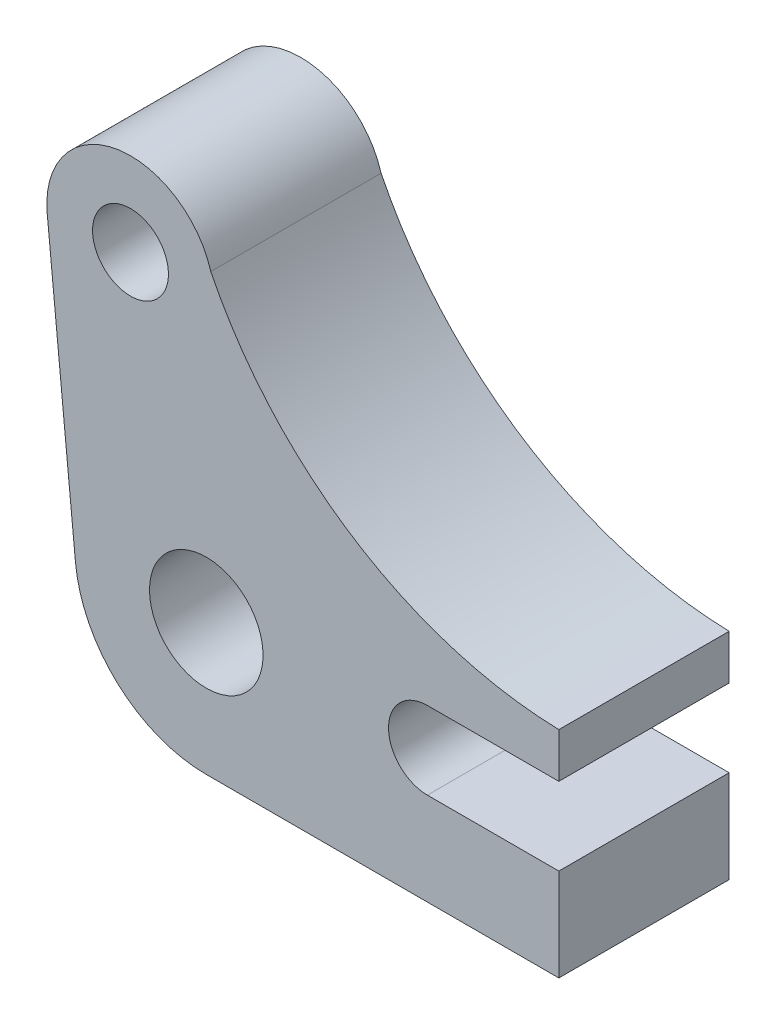
ISO-10303-21;
HEADER;
FILE_DESCRIPTION(('STEP AP214'),'2;1');
FILE_NAME('part.step','',(''),(''),'','','');
FILE_SCHEMA(('AUTOMOTIVE_DESIGN { 1 0 10303 214 1 1 1 1 }'));
ENDSEC;
DATA;
#1=APPLICATION_CONTEXT('core data for automotive mechanical design processes');
#2=APPLICATION_PROTOCOL_DEFINITION('international standard','automotive_design',2000,#1);
#3=PRODUCT_CONTEXT('',#1,'mechanical');
#4=PRODUCT('Part','Part','',(#3));
#5=PRODUCT_RELATED_PRODUCT_CATEGORY('part','',(#4));
#6=PRODUCT_DEFINITION_FORMATION('','',#4);
#7=PRODUCT_DEFINITION_CONTEXT('part definition',#1,'design');
#8=PRODUCT_DEFINITION('design','',#6,#7);
#9=PRODUCT_DEFINITION_SHAPE('','',#8);
#10=(LENGTH_UNIT() NAMED_UNIT(*) SI_UNIT(.MILLI.,.METRE.));
#11=(NAMED_UNIT(*) PLANE_ANGLE_UNIT() SI_UNIT($,.RADIAN.));
#12=(NAMED_UNIT(*) SI_UNIT($,.STERADIAN.) SOLID_ANGLE_UNIT());
#13=UNCERTAINTY_MEASURE_WITH_UNIT(LENGTH_MEASURE(1.E-05),#10,'distance_accuracy_value','');
#14=(GEOMETRIC_REPRESENTATION_CONTEXT(3) GLOBAL_UNCERTAINTY_ASSIGNED_CONTEXT((#13)) GLOBAL_UNIT_ASSIGNED_CONTEXT((#10,
#11,#12)) REPRESENTATION_CONTEXT('',''));
#15=CARTESIAN_POINT('',(0.,0.,0.));
#16=DIRECTION('',(0.,0.,1.));
#17=DIRECTION('',(1.,0.,0.));
#18=AXIS2_PLACEMENT_3D('',#15,#16,#17);
#19=CARTESIAN_POINT('',(-60.0180476161702,-52.9564208831454,28.5));
#20=DIRECTION('',(0.,0.,1.));
#21=DIRECTION('',(1.,0.,0.));
#22=AXIS2_PLACEMENT_3D('',#19,#20,#21);
#23=PLANE('',#22);
#24=CARTESIAN_POINT('',(-72.700180587229,-5.62605533095061,28.5));
#25=DIRECTION('',(0.,0.,1.));
#26=DIRECTION('',(1.,0.,0.));
#27=AXIS2_PLACEMENT_3D('',#24,#25,#26);
#28=CIRCLE('',#27,6.34999999998991);
#29=CARTESIAN_POINT('',(-79.0501805872189,-5.62605533095061,28.5));
#30=VERTEX_POINT('',#29);
#31=EDGE_CURVE('E164',#30,#30,#28,.T.);
#32=ORIENTED_EDGE('',*,*,#31,.F.);
#33=EDGE_LOOP('',(#32));
#34=FACE_BOUND('',#33,.T.);
#35=CARTESIAN_POINT('',(-60.0180476161702,-52.9564208831454,28.5));
#36=DIRECTION('',(0.,0.,1.));
#37=DIRECTION('',(1.,0.,0.));
#38=AXIS2_PLACEMENT_3D('',#35,#36,#37);
#39=CIRCLE('',#38,22.);
#40=CARTESIAN_POINT('',(-81.9129183847161,-55.1045908086106,28.5));
#41=VERTEX_POINT('',#40);
#42=CARTESIAN_POINT('',(-60.0180476161702,-74.9564208831454,28.5));
#43=VERTEX_POINT('',#42);
#44=EDGE_CURVE('E188',#41,#43,#39,.T.);
#45=ORIENTED_EDGE('',*,*,#44,.T.);
#46=DIRECTION('',(1.,0.,0.));
#47=VECTOR('',#46,1.);
#48=CARTESIAN_POINT('',(-1.01804761617024,-74.9564208831454,28.5));
#49=LINE('',#48,#47);
#50=CARTESIAN_POINT('',(-1.01804761617024,-74.9564208831454,28.5));
#51=VERTEX_POINT('',#50);
#52=EDGE_CURVE('E112',#43,#51,#49,.T.);
#53=ORIENTED_EDGE('',*,*,#52,.T.);
#54=DIRECTION('',(0.,1.,0.));
#55=VECTOR('',#54,1.);
#56=CARTESIAN_POINT('',(-1.01804761617024,-59.4564208831454,28.5));
#57=LINE('',#56,#55);
#58=CARTESIAN_POINT('',(-1.01804761617024,-59.4564208831454,28.5));
#59=VERTEX_POINT('',#58);
#60=EDGE_CURVE('E217',#51,#59,#57,.T.);
#61=ORIENTED_EDGE('',*,*,#60,.T.);
#62=DIRECTION('',(-1.,0.,0.));
#63=VECTOR('',#62,1.);
#64=CARTESIAN_POINT('',(-23.0180476161702,-59.4564208831454,28.5));
#65=LINE('',#64,#63);
#66=CARTESIAN_POINT('',(-23.0180476161702,-59.4564208831454,28.5));
#67=VERTEX_POINT('',#66);
#68=EDGE_CURVE('E237',#59,#67,#65,.T.);
#69=ORIENTED_EDGE('',*,*,#68,.T.);
#70=CARTESIAN_POINT('',(-23.0180476161702,-52.9564208831454,28.5));
#71=DIRECTION('',(0.,0.,-1.));
#72=DIRECTION('',(-1.,0.,0.));
#73=AXIS2_PLACEMENT_3D('',#70,#71,#72);
#74=CIRCLE('',#73,6.5);
#75=CARTESIAN_POINT('',(-23.0180476161702,-46.4564208831454,28.5));
#76=VERTEX_POINT('',#75);
#77=EDGE_CURVE('E233',#67,#76,#74,.T.);
#78=ORIENTED_EDGE('',*,*,#77,.T.);
#79=DIRECTION('',(1.,0.,0.));
#80=VECTOR('',#79,1.);
#81=CARTESIAN_POINT('',(-1.01804761617024,-46.4564208831454,28.5));
#82=LINE('',#81,#80);
#83=CARTESIAN_POINT('',(-1.01804761617024,-46.4564208831454,28.5));
#84=VERTEX_POINT('',#83);
#85=EDGE_CURVE('E236',#76,#84,#82,.T.);
#86=ORIENTED_EDGE('',*,*,#85,.T.);
#87=DIRECTION('',(0.,1.,0.));
#88=VECTOR('',#87,1.);
#89=CARTESIAN_POINT('',(-1.01804761617024,-46.4564208831454,28.5));
#90=LINE('',#89,#88);
#91=CARTESIAN_POINT('',(-1.01804761617022,-38.9564208831454,28.5));
#92=VERTEX_POINT('',#91);
#93=EDGE_CURVE('E137',#84,#92,#90,.T.);
#94=ORIENTED_EDGE('',*,*,#93,.T.);
#95=CARTESIAN_POINT('',(0.786907620125597,28.0192622906377,28.5));
#96=DIRECTION('',(0.,0.,-1.));
#97=DIRECTION('',(-1.,0.,0.));
#98=AXIS2_PLACEMENT_3D('',#95,#96,#97);
#99=CIRCLE('',#98,67.);
#100=CARTESIAN_POINT('',(-59.2631461078246,-1.69590298351636,28.5));
#101=VERTEX_POINT('',#100);
#102=EDGE_CURVE('E131',#92,#101,#99,.T.);
#103=ORIENTED_EDGE('',*,*,#102,.T.);
#104=CARTESIAN_POINT('',(-72.7001808261938,-5.62605539498104,28.5));
#105=DIRECTION('',(0.,0.,1.));
#106=DIRECTION('',(1.,0.,0.));
#107=AXIS2_PLACEMENT_3D('',#104,#105,#106);
#108=CIRCLE('',#107,14.);
#109=CARTESIAN_POINT('',(-86.6332804061776,-6.99307262027707,28.5));
#110=VERTEX_POINT('',#109);
#111=EDGE_CURVE('E135',#101,#110,#108,.T.);
#112=ORIENTED_EDGE('',*,*,#111,.T.);
#113=DIRECTION('',(0.0976440875211458,-0.995221398570269,0.));
#114=VECTOR('',#113,1.);
#115=CARTESIAN_POINT('',(-86.6332804061776,-6.99307262027707,28.5));
#116=LINE('',#115,#114);
#117=EDGE_CURVE('E63',#110,#41,#116,.T.);
#118=ORIENTED_EDGE('',*,*,#117,.T.);
#119=EDGE_LOOP('',(#45,#53,#61,#69,#78,#86,#94,#103,#112,#118));
#120=FACE_BOUND('',#119,.T.);
#121=CARTESIAN_POINT('',(-60.0180476161702,-52.9564208831454,28.5));
#122=DIRECTION('',(0.,0.,1.));
#123=DIRECTION('',(1.,0.,0.));
#124=AXIS2_PLACEMENT_3D('',#121,#122,#123);
#125=CIRCLE('',#124,9.5);
#126=CARTESIAN_POINT('',(-69.5180476161702,-52.9564208831454,28.5));
#127=VERTEX_POINT('',#126);
#128=EDGE_CURVE('E255',#127,#127,#125,.T.);
#129=ORIENTED_EDGE('',*,*,#128,.F.);
#130=EDGE_LOOP('',(#129));
#131=FACE_BOUND('',#130,.T.);
#132=ADVANCED_FACE('F45',(#34,#120,#131),#23,.T.);
#133=CARTESIAN_POINT('',(-60.0180476161702,-52.9564208831454,0.));
#134=DIRECTION('',(0.,0.,1.));
#135=DIRECTION('',(1.,0.,0.));
#136=AXIS2_PLACEMENT_3D('',#133,#134,#135);
#137=PLANE('',#136);
#138=CARTESIAN_POINT('',(-60.0180476161702,-52.9564208831454,0.));
#139=DIRECTION('',(0.,0.,1.));
#140=DIRECTION('',(1.,0.,0.));
#141=AXIS2_PLACEMENT_3D('',#138,#139,#140);
#142=CIRCLE('',#141,22.);
#143=CARTESIAN_POINT('',(-81.9129183847161,-55.1045908086106,0.));
#144=VERTEX_POINT('',#143);
#145=CARTESIAN_POINT('',(-60.0180476161702,-74.9564208831454,0.));
#146=VERTEX_POINT('',#145);
#147=EDGE_CURVE('E159',#144,#146,#142,.T.);
#148=ORIENTED_EDGE('',*,*,#147,.F.);
#149=DIRECTION('',(0.0976440875211458,-0.995221398570269,0.));
#150=VECTOR('',#149,1.);
#151=CARTESIAN_POINT('',(-86.6332804061776,-6.99307262027707,0.));
#152=LINE('',#151,#150);
#153=CARTESIAN_POINT('',(-86.6332804061776,-6.99307262027707,0.));
#154=VERTEX_POINT('',#153);
#155=EDGE_CURVE('E104',#154,#144,#152,.T.);
#156=ORIENTED_EDGE('',*,*,#155,.F.);
#157=CARTESIAN_POINT('',(-72.7001808261938,-5.62605539498104,0.));
#158=DIRECTION('',(0.,0.,1.));
#159=DIRECTION('',(1.,0.,0.));
#160=AXIS2_PLACEMENT_3D('',#157,#158,#159);
#161=CIRCLE('',#160,14.);
#162=CARTESIAN_POINT('',(-59.2631461078246,-1.69590298351636,0.));
#163=VERTEX_POINT('',#162);
#164=EDGE_CURVE('E98',#163,#154,#161,.T.);
#165=ORIENTED_EDGE('',*,*,#164,.F.);
#166=CARTESIAN_POINT('',(0.786907620125597,28.0192622906377,0.));
#167=DIRECTION('',(0.,0.,-1.));
#168=DIRECTION('',(-1.,0.,0.));
#169=AXIS2_PLACEMENT_3D('',#166,#167,#168);
#170=CIRCLE('',#169,67.);
#171=CARTESIAN_POINT('',(-1.01804761617022,-38.9564208831454,0.));
#172=VERTEX_POINT('',#171);
#173=EDGE_CURVE('E146',#172,#163,#170,.T.);
#174=ORIENTED_EDGE('',*,*,#173,.F.);
#175=DIRECTION('',(0.,1.,0.));
#176=VECTOR('',#175,1.);
#177=CARTESIAN_POINT('',(-1.01804761617024,-46.4564208831454,0.));
#178=LINE('',#177,#176);
#179=CARTESIAN_POINT('',(-1.01804761617024,-46.4564208831454,0.));
#180=VERTEX_POINT('',#179);
#181=EDGE_CURVE('E179',#180,#172,#178,.T.);
#182=ORIENTED_EDGE('',*,*,#181,.F.);
#183=DIRECTION('',(1.,0.,0.));
#184=VECTOR('',#183,1.);
#185=CARTESIAN_POINT('',(-1.01804761617024,-46.4564208831454,0.));
#186=LINE('',#185,#184);
#187=CARTESIAN_POINT('',(-23.0180476161702,-46.4564208831454,0.));
#188=VERTEX_POINT('',#187);
#189=EDGE_CURVE('E176',#188,#180,#186,.T.);
#190=ORIENTED_EDGE('',*,*,#189,.F.);
#191=CARTESIAN_POINT('',(-23.0180476161702,-52.9564208831454,0.));
#192=DIRECTION('',(0.,0.,-1.));
#193=DIRECTION('',(-1.,0.,0.));
#194=AXIS2_PLACEMENT_3D('',#191,#192,#193);
#195=CIRCLE('',#194,6.5);
#196=CARTESIAN_POINT('',(-23.0180476161702,-59.4564208831454,0.));
#197=VERTEX_POINT('',#196);
#198=EDGE_CURVE('E173',#197,#188,#195,.T.);
#199=ORIENTED_EDGE('',*,*,#198,.F.);
#200=DIRECTION('',(-1.,0.,0.));
#201=VECTOR('',#200,1.);
#202=CARTESIAN_POINT('',(-23.0180476161702,-59.4564208831454,0.));
#203=LINE('',#202,#201);
#204=CARTESIAN_POINT('',(-1.01804761617024,-59.4564208831454,0.));
#205=VERTEX_POINT('',#204);
#206=EDGE_CURVE('E170',#205,#197,#203,.T.);
#207=ORIENTED_EDGE('',*,*,#206,.F.);
#208=DIRECTION('',(0.,1.,0.));
#209=VECTOR('',#208,1.);
#210=CARTESIAN_POINT('',(-1.01804761617024,-59.4564208831454,0.));
#211=LINE('',#210,#209);
#212=CARTESIAN_POINT('',(-1.01804761617024,-74.9564208831454,0.));
#213=VERTEX_POINT('',#212);
#214=EDGE_CURVE('E167',#213,#205,#211,.T.);
#215=ORIENTED_EDGE('',*,*,#214,.F.);
#216=DIRECTION('',(1.,0.,0.));
#217=VECTOR('',#216,1.);
#218=CARTESIAN_POINT('',(-1.01804761617024,-74.9564208831454,0.));
#219=LINE('',#218,#217);
#220=EDGE_CURVE('E163',#146,#213,#219,.T.);
#221=ORIENTED_EDGE('',*,*,#220,.F.);
#222=EDGE_LOOP('',(#148,#156,#165,#174,#182,#190,#199,#207,#215,#221));
#223=FACE_BOUND('',#222,.T.);
#224=CARTESIAN_POINT('',(-72.700180587229,-5.62605533095061,0.));
#225=DIRECTION('',(0.,0.,1.));
#226=DIRECTION('',(1.,0.,0.));
#227=AXIS2_PLACEMENT_3D('',#224,#225,#226);
#228=CIRCLE('',#227,6.34999999998991);
#229=CARTESIAN_POINT('',(-79.0501805872189,-5.62605533095061,0.));
#230=VERTEX_POINT('',#229);
#231=EDGE_CURVE('E251',#230,#230,#228,.T.);
#232=ORIENTED_EDGE('',*,*,#231,.T.);
#233=EDGE_LOOP('',(#232));
#234=FACE_BOUND('',#233,.T.);
#235=CARTESIAN_POINT('',(-60.0180476161702,-52.9564208831454,0.));
#236=DIRECTION('',(0.,0.,1.));
#237=DIRECTION('',(1.,0.,0.));
#238=AXIS2_PLACEMENT_3D('',#235,#236,#237);
#239=CIRCLE('',#238,9.5);
#240=CARTESIAN_POINT('',(-69.5180476161702,-52.9564208831454,0.));
#241=VERTEX_POINT('',#240);
#242=EDGE_CURVE('E259',#241,#241,#239,.T.);
#243=ORIENTED_EDGE('',*,*,#242,.T.);
#244=EDGE_LOOP('',(#243));
#245=FACE_BOUND('',#244,.T.);
#246=ADVANCED_FACE('F221',(#223,#234,#245),#137,.F.);
#247=CARTESIAN_POINT('',(-60.0180476161702,-52.9564208831454,28.5));
#248=DIRECTION('',(0.,0.,-1.));
#249=DIRECTION('',(-1.,0.,0.));
#250=AXIS2_PLACEMENT_3D('',#247,#248,#249);
#251=CYLINDRICAL_SURFACE('',#250,22.);
#252=ORIENTED_EDGE('',*,*,#147,.T.);
#253=DIRECTION('',(0.,0.,-1.));
#254=VECTOR('',#253,1.);
#255=CARTESIAN_POINT('',(-60.0180476161702,-74.9564208831454,28.5));
#256=LINE('',#255,#254);
#257=EDGE_CURVE('E11',#43,#146,#256,.T.);
#258=ORIENTED_EDGE('',*,*,#257,.F.);
#259=ORIENTED_EDGE('',*,*,#44,.F.);
#260=DIRECTION('',(0.,0.,-1.));
#261=VECTOR('',#260,1.);
#262=CARTESIAN_POINT('',(-81.9129183847161,-55.1045908086106,28.5));
#263=LINE('',#262,#261);
#264=EDGE_CURVE('E155',#41,#144,#263,.T.);
#265=ORIENTED_EDGE('',*,*,#264,.T.);
#266=EDGE_LOOP('',(#252,#258,#259,#265));
#267=FACE_BOUND('',#266,.T.);
#268=ADVANCED_FACE('F47',(#267),#251,.T.);
#269=CARTESIAN_POINT('',(-1.01804761617024,-74.9564208831454,28.5));
#270=DIRECTION('',(0.,1.,0.));
#271=DIRECTION('',(-1.,0.,0.));
#272=AXIS2_PLACEMENT_3D('',#269,#270,#271);
#273=PLANE('',#272);
#274=ORIENTED_EDGE('',*,*,#220,.T.);
#275=DIRECTION('',(0.,0.,-1.));
#276=VECTOR('',#275,1.);
#277=CARTESIAN_POINT('',(-1.01804761617024,-74.9564208831454,28.5));
#278=LINE('',#277,#276);
#279=EDGE_CURVE('E55',#51,#213,#278,.T.);
#280=ORIENTED_EDGE('',*,*,#279,.F.);
#281=ORIENTED_EDGE('',*,*,#52,.F.);
#282=ORIENTED_EDGE('',*,*,#257,.T.);
#283=EDGE_LOOP('',(#274,#280,#281,#282));
#284=FACE_BOUND('',#283,.T.);
#285=ADVANCED_FACE('F301',(#284),#273,.F.);
#286=CARTESIAN_POINT('',(-1.01804761617024,-59.4564208831454,28.5));
#287=DIRECTION('',(-1.,0.,0.));
#288=DIRECTION('',(0.,0.,1.));
#289=AXIS2_PLACEMENT_3D('',#286,#287,#288);
#290=PLANE('',#289);
#291=ORIENTED_EDGE('',*,*,#214,.T.);
#292=DIRECTION('',(0.,0.,-1.));
#293=VECTOR('',#292,1.);
#294=CARTESIAN_POINT('',(-1.01804761617024,-59.4564208831454,28.5));
#295=LINE('',#294,#293);
#296=EDGE_CURVE('E207',#59,#205,#295,.T.);
#297=ORIENTED_EDGE('',*,*,#296,.F.);
#298=ORIENTED_EDGE('',*,*,#60,.F.);
#299=ORIENTED_EDGE('',*,*,#279,.T.);
#300=EDGE_LOOP('',(#291,#297,#298,#299));
#301=FACE_BOUND('',#300,.T.);
#302=ADVANCED_FACE('F215',(#301),#290,.F.);
#303=CARTESIAN_POINT('',(-23.0180476161702,-59.4564208831454,28.5));
#304=DIRECTION('',(0.,-1.,0.));
#305=DIRECTION('',(1.,0.,0.));
#306=AXIS2_PLACEMENT_3D('',#303,#304,#305);
#307=PLANE('',#306);
#308=ORIENTED_EDGE('',*,*,#206,.T.);
#309=DIRECTION('',(0.,0.,-1.));
#310=VECTOR('',#309,1.);
#311=CARTESIAN_POINT('',(-23.0180476161702,-59.4564208831454,28.5));
#312=LINE('',#311,#310);
#313=EDGE_CURVE('E203',#67,#197,#312,.T.);
#314=ORIENTED_EDGE('',*,*,#313,.F.);
#315=ORIENTED_EDGE('',*,*,#68,.F.);
#316=ORIENTED_EDGE('',*,*,#296,.T.);
#317=EDGE_LOOP('',(#308,#314,#315,#316));
#318=FACE_BOUND('',#317,.T.);
#319=ADVANCED_FACE('F227',(#318),#307,.F.);
#320=CARTESIAN_POINT('',(-23.0180476161702,-52.9564208831454,28.5));
#321=DIRECTION('',(0.,0.,-1.));
#322=DIRECTION('',(-1.,0.,0.));
#323=AXIS2_PLACEMENT_3D('',#320,#321,#322);
#324=CYLINDRICAL_SURFACE('',#323,6.5);
#325=ORIENTED_EDGE('',*,*,#198,.T.);
#326=DIRECTION('',(0.,0.,-1.));
#327=VECTOR('',#326,1.);
#328=CARTESIAN_POINT('',(-23.0180476161702,-46.4564208831454,28.5));
#329=LINE('',#328,#327);
#330=EDGE_CURVE('E199',#76,#188,#329,.T.);
#331=ORIENTED_EDGE('',*,*,#330,.F.);
#332=ORIENTED_EDGE('',*,*,#77,.F.);
#333=ORIENTED_EDGE('',*,*,#313,.T.);
#334=EDGE_LOOP('',(#325,#331,#332,#333));
#335=FACE_BOUND('',#334,.T.);
#336=ADVANCED_FACE('F231',(#335),#324,.F.);
#337=CARTESIAN_POINT('',(-1.01804761617024,-46.4564208831454,28.5));
#338=DIRECTION('',(0.,1.,0.));
#339=DIRECTION('',(-1.,0.,0.));
#340=AXIS2_PLACEMENT_3D('',#337,#338,#339);
#341=PLANE('',#340);
#342=ORIENTED_EDGE('',*,*,#189,.T.);
#343=DIRECTION('',(0.,0.,-1.));
#344=VECTOR('',#343,1.);
#345=CARTESIAN_POINT('',(-1.01804761617024,-46.4564208831454,28.5));
#346=LINE('',#345,#344);
#347=EDGE_CURVE('E195',#84,#180,#346,.T.);
#348=ORIENTED_EDGE('',*,*,#347,.F.);
#349=ORIENTED_EDGE('',*,*,#85,.F.);
#350=ORIENTED_EDGE('',*,*,#330,.T.);
#351=EDGE_LOOP('',(#342,#348,#349,#350));
#352=FACE_BOUND('',#351,.T.);
#353=ADVANCED_FACE('F291',(#352),#341,.F.);
#354=CARTESIAN_POINT('',(-1.01804761617024,-46.4564208831454,28.5));
#355=DIRECTION('',(-1.,0.,0.));
#356=DIRECTION('',(0.,0.,1.));
#357=AXIS2_PLACEMENT_3D('',#354,#355,#356);
#358=PLANE('',#357);
#359=ORIENTED_EDGE('',*,*,#181,.T.);
#360=DIRECTION('',(0.,0.,-1.));
#361=VECTOR('',#360,1.);
#362=CARTESIAN_POINT('',(-1.01804761617022,-38.9564208831454,28.5));
#363=LINE('',#362,#361);
#364=EDGE_CURVE('E148',#92,#172,#363,.T.);
#365=ORIENTED_EDGE('',*,*,#364,.F.);
#366=ORIENTED_EDGE('',*,*,#93,.F.);
#367=ORIENTED_EDGE('',*,*,#347,.T.);
#368=EDGE_LOOP('',(#359,#365,#366,#367));
#369=FACE_BOUND('',#368,.T.);
#370=ADVANCED_FACE('F288',(#369),#358,.F.);
#371=CARTESIAN_POINT('',(0.786907620125597,28.0192622906377,28.5));
#372=DIRECTION('',(0.,0.,-1.));
#373=DIRECTION('',(-1.,0.,0.));
#374=AXIS2_PLACEMENT_3D('',#371,#372,#373);
#375=CYLINDRICAL_SURFACE('',#374,67.);
#376=ORIENTED_EDGE('',*,*,#173,.T.);
#377=DIRECTION('',(0.,0.,-1.));
#378=VECTOR('',#377,1.);
#379=CARTESIAN_POINT('',(-59.2631461078246,-1.69590298351636,28.5));
#380=LINE('',#379,#378);
#381=EDGE_CURVE('E143',#101,#163,#380,.T.);
#382=ORIENTED_EDGE('',*,*,#381,.F.);
#383=ORIENTED_EDGE('',*,*,#102,.F.);
#384=ORIENTED_EDGE('',*,*,#364,.T.);
#385=EDGE_LOOP('',(#376,#382,#383,#384));
#386=FACE_BOUND('',#385,.T.);
#387=ADVANCED_FACE('F144',(#386),#375,.F.);
#388=CARTESIAN_POINT('',(-72.7001808261938,-5.62605539498104,28.5));
#389=DIRECTION('',(0.,0.,-1.));
#390=DIRECTION('',(-1.,0.,0.));
#391=AXIS2_PLACEMENT_3D('',#388,#389,#390);
#392=CYLINDRICAL_SURFACE('',#391,14.);
#393=ORIENTED_EDGE('',*,*,#164,.T.);
#394=DIRECTION('',(0.,0.,-1.));
#395=VECTOR('',#394,1.);
#396=CARTESIAN_POINT('',(-86.6332804061776,-6.99307262027707,28.5));
#397=LINE('',#396,#395);
#398=EDGE_CURVE('E149',#110,#154,#397,.T.);
#399=ORIENTED_EDGE('',*,*,#398,.F.);
#400=ORIENTED_EDGE('',*,*,#111,.F.);
#401=ORIENTED_EDGE('',*,*,#381,.T.);
#402=EDGE_LOOP('',(#393,#399,#400,#401));
#403=FACE_BOUND('',#402,.T.);
#404=ADVANCED_FACE('F151',(#403),#392,.T.);
#405=CARTESIAN_POINT('',(-86.6332804061776,-6.99307262027707,28.5));
#406=DIRECTION('',(0.995221398570269,0.0976440875211458,0.));
#407=DIRECTION('',(-0.0976440875211458,0.995221398570269,0.));
#408=AXIS2_PLACEMENT_3D('',#405,#406,#407);
#409=PLANE('',#408);
#410=ORIENTED_EDGE('',*,*,#155,.T.);
#411=ORIENTED_EDGE('',*,*,#264,.F.);
#412=ORIENTED_EDGE('',*,*,#117,.F.);
#413=ORIENTED_EDGE('',*,*,#398,.T.);
#414=EDGE_LOOP('',(#410,#411,#412,#413));
#415=FACE_BOUND('',#414,.T.);
#416=ADVANCED_FACE('F281',(#415),#409,.F.);
#417=CARTESIAN_POINT('',(-72.700180587229,-5.62605533095061,28.5));
#418=DIRECTION('',(0.,0.,-1.));
#419=DIRECTION('',(-1.,0.,0.));
#420=AXIS2_PLACEMENT_3D('',#417,#418,#419);
#421=CYLINDRICAL_SURFACE('',#420,6.34999999998991);
#422=CARTESIAN_POINT('',(-79.0501805872189,-5.62605533095061,28.5));
#423=CARTESIAN_POINT('',(-79.0501805872189,-5.62605533095061,28.203125));
#424=CARTESIAN_POINT('',(-79.0501805872189,-5.62605533095061,27.90625));
#425=CARTESIAN_POINT('',(-79.0501805872189,-5.62605533095061,27.3125));
#426=CARTESIAN_POINT('',(-79.0501805872189,-5.62605533095061,27.015625));
#427=CARTESIAN_POINT('',(-79.0501805872189,-5.62605533095061,26.421875));
#428=CARTESIAN_POINT('',(-79.0501805872189,-5.62605533095061,26.125));
#429=CARTESIAN_POINT('',(-79.0501805872189,-5.62605533095061,25.53125));
#430=CARTESIAN_POINT('',(-79.0501805872189,-5.62605533095061,25.234375));
#431=CARTESIAN_POINT('',(-79.0501805872189,-5.62605533095061,24.640625));
#432=CARTESIAN_POINT('',(-79.0501805872189,-5.62605533095061,24.34375));
#433=CARTESIAN_POINT('',(-79.0501805872189,-5.62605533095061,23.75));
#434=CARTESIAN_POINT('',(-79.0501805872189,-5.62605533095061,23.453125));
#435=CARTESIAN_POINT('',(-79.0501805872189,-5.62605533095061,22.859375));
#436=CARTESIAN_POINT('',(-79.0501805872189,-5.62605533095061,22.5625));
#437=CARTESIAN_POINT('',(-79.0501805872189,-5.62605533095061,21.96875));
#438=CARTESIAN_POINT('',(-79.0501805872189,-5.62605533095061,21.671875));
#439=CARTESIAN_POINT('',(-79.0501805872189,-5.62605533095061,21.078125));
#440=CARTESIAN_POINT('',(-79.0501805872189,-5.62605533095061,20.78125));
#441=CARTESIAN_POINT('',(-79.0501805872189,-5.62605533095061,20.1875));
#442=CARTESIAN_POINT('',(-79.0501805872189,-5.62605533095061,19.890625));
#443=CARTESIAN_POINT('',(-79.0501805872189,-5.62605533095061,19.296875));
#444=CARTESIAN_POINT('',(-79.0501805872189,-5.62605533095061,19.));
#445=CARTESIAN_POINT('',(-79.0501805872189,-5.62605533095061,18.40625));
#446=CARTESIAN_POINT('',(-79.0501805872189,-5.62605533095061,18.109375));
#447=CARTESIAN_POINT('',(-79.0501805872189,-5.62605533095061,17.515625));
#448=CARTESIAN_POINT('',(-79.0501805872189,-5.62605533095061,17.21875));
#449=CARTESIAN_POINT('',(-79.0501805872189,-5.62605533095061,16.625));
#450=CARTESIAN_POINT('',(-79.0501805872189,-5.62605533095061,16.328125));
#451=CARTESIAN_POINT('',(-79.0501805872189,-5.62605533095061,15.734375));
#452=CARTESIAN_POINT('',(-79.0501805872189,-5.62605533095061,15.4375));
#453=CARTESIAN_POINT('',(-79.0501805872189,-5.62605533095061,14.84375));
#454=CARTESIAN_POINT('',(-79.0501805872189,-5.62605533095061,14.546875));
#455=CARTESIAN_POINT('',(-79.0501805872189,-5.62605533095061,13.953125));
#456=CARTESIAN_POINT('',(-79.0501805872189,-5.62605533095061,13.65625));
#457=CARTESIAN_POINT('',(-79.0501805872189,-5.62605533095061,13.0625));
#458=CARTESIAN_POINT('',(-79.0501805872189,-5.62605533095061,12.765625));
#459=CARTESIAN_POINT('',(-79.0501805872189,-5.62605533095061,12.171875));
#460=CARTESIAN_POINT('',(-79.0501805872189,-5.62605533095061,11.875));
#461=CARTESIAN_POINT('',(-79.0501805872189,-5.62605533095061,11.28125));
#462=CARTESIAN_POINT('',(-79.0501805872189,-5.62605533095061,10.984375));
#463=CARTESIAN_POINT('',(-79.0501805872189,-5.62605533095061,10.390625));
#464=CARTESIAN_POINT('',(-79.0501805872189,-5.62605533095061,10.09375));
#465=CARTESIAN_POINT('',(-79.0501805872189,-5.62605533095061,9.5));
#466=CARTESIAN_POINT('',(-79.0501805872189,-5.62605533095061,9.203125));
#467=CARTESIAN_POINT('',(-79.0501805872189,-5.62605533095061,8.609375));
#468=CARTESIAN_POINT('',(-79.0501805872189,-5.62605533095061,8.3125));
#469=CARTESIAN_POINT('',(-79.0501805872189,-5.62605533095061,7.71875));
#470=CARTESIAN_POINT('',(-79.0501805872189,-5.62605533095061,7.421875));
#471=CARTESIAN_POINT('',(-79.0501805872189,-5.62605533095061,6.828125));
#472=CARTESIAN_POINT('',(-79.0501805872189,-5.62605533095061,6.53125));
#473=CARTESIAN_POINT('',(-79.0501805872189,-5.62605533095061,5.9375));
#474=CARTESIAN_POINT('',(-79.0501805872189,-5.62605533095061,5.640625));
#475=CARTESIAN_POINT('',(-79.0501805872189,-5.62605533095061,5.046875));
#476=CARTESIAN_POINT('',(-79.0501805872189,-5.62605533095061,4.75));
#477=CARTESIAN_POINT('',(-79.0501805872189,-5.62605533095061,4.15625));
#478=CARTESIAN_POINT('',(-79.0501805872189,-5.62605533095061,3.859375));
#479=CARTESIAN_POINT('',(-79.0501805872189,-5.62605533095061,3.265625));
#480=CARTESIAN_POINT('',(-79.0501805872189,-5.62605533095061,2.96875));
#481=CARTESIAN_POINT('',(-79.0501805872189,-5.62605533095061,2.375));
#482=CARTESIAN_POINT('',(-79.0501805872189,-5.62605533095061,2.078125));
#483=CARTESIAN_POINT('',(-79.0501805872189,-5.62605533095061,1.484375));
#484=CARTESIAN_POINT('',(-79.0501805872189,-5.62605533095061,1.1875));
#485=CARTESIAN_POINT('',(-79.0501805872189,-5.62605533095061,0.593749999999999));
#486=CARTESIAN_POINT('',(-79.0501805872189,-5.62605533095061,0.296875));
#487=CARTESIAN_POINT('',(-79.0501805872189,-5.62605533095061,0.));
#488=B_SPLINE_CURVE_WITH_KNOTS('',3,(#422,#423,#424,#425,#426,#427,#428,#429,#430,#431,#432,
#433,#434,#435,#436,#437,#438,#439,#440,#441,#442,#443,#444,#445,#446,#447,#448,#449,#450,#451,
#452,#453,#454,#455,#456,#457,#458,#459,#460,#461,#462,#463,#464,#465,#466,#467,#468,#469,#470,
#471,#472,#473,#474,#475,#476,#477,#478,#479,#480,#481,#482,#483,#484,#485,#486,#487),
.UNSPECIFIED.,.F.,.F.,(4,2,2,2,2,2,2,2,2,2,2,2,2,2,2,2,2,2,2,2,2,2,2,2,2,2,2,2,2,2,2,2,4),(0.,
0.890624999999999,1.78125,2.671875,3.5625,4.453125,5.34375,6.234375,7.125,8.015625,8.90625,
9.796875,10.6875,11.578125,12.46875,13.359375,14.25,15.140625,16.03125,16.921875,17.8125,
18.703125,19.59375,20.484375,21.375,22.265625,23.15625,24.046875,24.9375,25.828125,26.71875,
27.609375,28.5),.UNSPECIFIED.);
#489=EDGE_CURVE('BSEAM278',#30,#230,#488,.T.);
#490=ORIENTED_EDGE('',*,*,#31,.T.);
#491=ORIENTED_EDGE('',*,*,#231,.F.);
#492=ORIENTED_EDGE('',*,*,#489,.T.);
#493=ORIENTED_EDGE('',*,*,#489,.F.);
#494=EDGE_LOOP('',(#490,#492,#491,#493));
#495=FACE_BOUND('',#494,.T.);
#496=ADVANCED_FACE('F278',(#495),#421,.F.);
#497=CARTESIAN_POINT('',(-60.0180476161702,-52.9564208831454,28.5));
#498=DIRECTION('',(0.,0.,-1.));
#499=DIRECTION('',(-1.,0.,0.));
#500=AXIS2_PLACEMENT_3D('',#497,#498,#499);
#501=CYLINDRICAL_SURFACE('',#500,9.5);
#502=CARTESIAN_POINT('',(-69.5180476161702,-52.9564208831454,28.5));
#503=CARTESIAN_POINT('',(-69.5180476161702,-52.9564208831454,28.203125));
#504=CARTESIAN_POINT('',(-69.5180476161702,-52.9564208831454,27.90625));
#505=CARTESIAN_POINT('',(-69.5180476161702,-52.9564208831454,27.3125));
#506=CARTESIAN_POINT('',(-69.5180476161702,-52.9564208831454,27.015625));
#507=CARTESIAN_POINT('',(-69.5180476161702,-52.9564208831454,26.421875));
#508=CARTESIAN_POINT('',(-69.5180476161702,-52.9564208831454,26.125));
#509=CARTESIAN_POINT('',(-69.5180476161702,-52.9564208831454,25.53125));
#510=CARTESIAN_POINT('',(-69.5180476161702,-52.9564208831454,25.234375));
#511=CARTESIAN_POINT('',(-69.5180476161702,-52.9564208831454,24.640625));
#512=CARTESIAN_POINT('',(-69.5180476161702,-52.9564208831454,24.34375));
#513=CARTESIAN_POINT('',(-69.5180476161702,-52.9564208831454,23.75));
#514=CARTESIAN_POINT('',(-69.5180476161702,-52.9564208831454,23.453125));
#515=CARTESIAN_POINT('',(-69.5180476161702,-52.9564208831454,22.859375));
#516=CARTESIAN_POINT('',(-69.5180476161702,-52.9564208831454,22.5625));
#517=CARTESIAN_POINT('',(-69.5180476161702,-52.9564208831454,21.96875));
#518=CARTESIAN_POINT('',(-69.5180476161702,-52.9564208831454,21.671875));
#519=CARTESIAN_POINT('',(-69.5180476161702,-52.9564208831454,21.078125));
#520=CARTESIAN_POINT('',(-69.5180476161702,-52.9564208831454,20.78125));
#521=CARTESIAN_POINT('',(-69.5180476161702,-52.9564208831454,20.1875));
#522=CARTESIAN_POINT('',(-69.5180476161702,-52.9564208831454,19.890625));
#523=CARTESIAN_POINT('',(-69.5180476161702,-52.9564208831454,19.296875));
#524=CARTESIAN_POINT('',(-69.5180476161702,-52.9564208831454,19.));
#525=CARTESIAN_POINT('',(-69.5180476161702,-52.9564208831454,18.40625));
#526=CARTESIAN_POINT('',(-69.5180476161702,-52.9564208831454,18.109375));
#527=CARTESIAN_POINT('',(-69.5180476161702,-52.9564208831454,17.515625));
#528=CARTESIAN_POINT('',(-69.5180476161702,-52.9564208831454,17.21875));
#529=CARTESIAN_POINT('',(-69.5180476161702,-52.9564208831454,16.625));
#530=CARTESIAN_POINT('',(-69.5180476161702,-52.9564208831454,16.328125));
#531=CARTESIAN_POINT('',(-69.5180476161702,-52.9564208831454,15.734375));
#532=CARTESIAN_POINT('',(-69.5180476161702,-52.9564208831454,15.4375));
#533=CARTESIAN_POINT('',(-69.5180476161702,-52.9564208831454,14.84375));
#534=CARTESIAN_POINT('',(-69.5180476161702,-52.9564208831454,14.546875));
#535=CARTESIAN_POINT('',(-69.5180476161702,-52.9564208831454,13.953125));
#536=CARTESIAN_POINT('',(-69.5180476161702,-52.9564208831454,13.65625));
#537=CARTESIAN_POINT('',(-69.5180476161702,-52.9564208831454,13.0625));
#538=CARTESIAN_POINT('',(-69.5180476161702,-52.9564208831454,12.765625));
#539=CARTESIAN_POINT('',(-69.5180476161702,-52.9564208831454,12.171875));
#540=CARTESIAN_POINT('',(-69.5180476161702,-52.9564208831454,11.875));
#541=CARTESIAN_POINT('',(-69.5180476161702,-52.9564208831454,11.28125));
#542=CARTESIAN_POINT('',(-69.5180476161702,-52.9564208831454,10.984375));
#543=CARTESIAN_POINT('',(-69.5180476161702,-52.9564208831454,10.390625));
#544=CARTESIAN_POINT('',(-69.5180476161702,-52.9564208831454,10.09375));
#545=CARTESIAN_POINT('',(-69.5180476161702,-52.9564208831454,9.5));
#546=CARTESIAN_POINT('',(-69.5180476161702,-52.9564208831454,9.203125));
#547=CARTESIAN_POINT('',(-69.5180476161702,-52.9564208831454,8.609375));
#548=CARTESIAN_POINT('',(-69.5180476161702,-52.9564208831454,8.3125));
#549=CARTESIAN_POINT('',(-69.5180476161702,-52.9564208831454,7.71875));
#550=CARTESIAN_POINT('',(-69.5180476161702,-52.9564208831454,7.421875));
#551=CARTESIAN_POINT('',(-69.5180476161702,-52.9564208831454,6.828125));
#552=CARTESIAN_POINT('',(-69.5180476161702,-52.9564208831454,6.53125));
#553=CARTESIAN_POINT('',(-69.5180476161702,-52.9564208831454,5.9375));
#554=CARTESIAN_POINT('',(-69.5180476161702,-52.9564208831454,5.640625));
#555=CARTESIAN_POINT('',(-69.5180476161702,-52.9564208831454,5.046875));
#556=CARTESIAN_POINT('',(-69.5180476161702,-52.9564208831454,4.75));
#557=CARTESIAN_POINT('',(-69.5180476161702,-52.9564208831454,4.15625));
#558=CARTESIAN_POINT('',(-69.5180476161702,-52.9564208831454,3.859375));
#559=CARTESIAN_POINT('',(-69.5180476161702,-52.9564208831454,3.265625));
#560=CARTESIAN_POINT('',(-69.5180476161702,-52.9564208831454,2.96875));
#561=CARTESIAN_POINT('',(-69.5180476161702,-52.9564208831454,2.375));
#562=CARTESIAN_POINT('',(-69.5180476161702,-52.9564208831454,2.078125));
#563=CARTESIAN_POINT('',(-69.5180476161702,-52.9564208831454,1.484375));
#564=CARTESIAN_POINT('',(-69.5180476161702,-52.9564208831454,1.1875));
#565=CARTESIAN_POINT('',(-69.5180476161702,-52.9564208831454,0.593749999999999));
#566=CARTESIAN_POINT('',(-69.5180476161702,-52.9564208831454,0.296875));
#567=CARTESIAN_POINT('',(-69.5180476161702,-52.9564208831454,0.));
#568=B_SPLINE_CURVE_WITH_KNOTS('',3,(#502,#503,#504,#505,#506,#507,#508,#509,#510,#511,#512,
#513,#514,#515,#516,#517,#518,#519,#520,#521,#522,#523,#524,#525,#526,#527,#528,#529,#530,#531,
#532,#533,#534,#535,#536,#537,#538,#539,#540,#541,#542,#543,#544,#545,#546,#547,#548,#549,#550,
#551,#552,#553,#554,#555,#556,#557,#558,#559,#560,#561,#562,#563,#564,#565,#566,#567),
.UNSPECIFIED.,.F.,.F.,(4,2,2,2,2,2,2,2,2,2,2,2,2,2,2,2,2,2,2,2,2,2,2,2,2,2,2,2,2,2,2,2,4),(0.,
0.890625000000003,1.78125,2.671875,3.5625,4.453125,5.34375,6.234375,7.125,8.015625,8.90625,
9.796875,10.6875,11.578125,12.46875,13.359375,14.25,15.140625,16.03125,16.921875,17.8125,
18.703125,19.59375,20.484375,21.375,22.265625,23.15625,24.046875,24.9375,25.828125,26.71875,
27.609375,28.5),.UNSPECIFIED.);
#569=EDGE_CURVE('BSEAM267',#127,#241,#568,.T.);
#570=ORIENTED_EDGE('',*,*,#128,.T.);
#571=ORIENTED_EDGE('',*,*,#242,.F.);
#572=ORIENTED_EDGE('',*,*,#569,.T.);
#573=ORIENTED_EDGE('',*,*,#569,.F.);
#574=EDGE_LOOP('',(#570,#572,#571,#573));
#575=FACE_BOUND('',#574,.T.);
#576=ADVANCED_FACE('F267',(#575),#501,.F.);
#577=CLOSED_SHELL('',(#132,#246,#268,#285,#302,#319,#336,#353,#370,#387,#404,#416,#496,#576));
#578=MANIFOLD_SOLID_BREP('B2',#577);
#579=ADVANCED_BREP_SHAPE_REPRESENTATION('',(#18,#578),#14);
#580=SHAPE_DEFINITION_REPRESENTATION(#9,#579);
ENDSEC;
END-ISO-10303-21;
